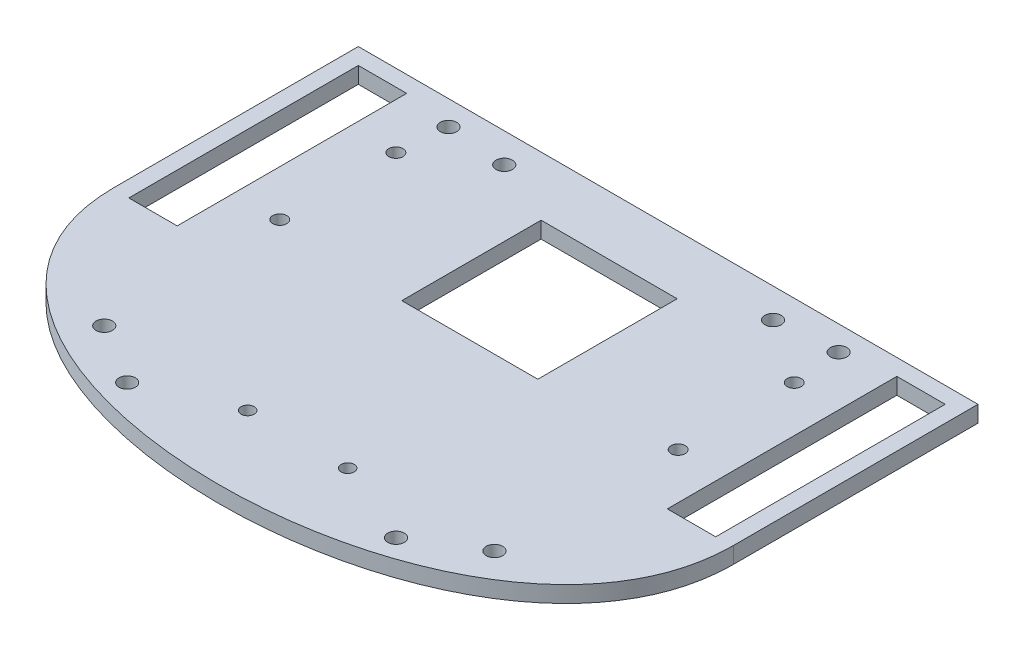
ISO-10303-21;
HEADER;
FILE_DESCRIPTION(('STEP AP214'),'2;1');
FILE_NAME('part.step','',(''),(''),'','','');
FILE_SCHEMA(('AUTOMOTIVE_DESIGN { 1 0 10303 214 1 1 1 1 }'));
ENDSEC;
DATA;
#1=APPLICATION_CONTEXT('core data for automotive mechanical design processes');
#2=APPLICATION_PROTOCOL_DEFINITION('international standard','automotive_design',2000,#1);
#3=PRODUCT_CONTEXT('',#1,'mechanical');
#4=PRODUCT('Part','Part','',(#3));
#5=PRODUCT_RELATED_PRODUCT_CATEGORY('part','',(#4));
#6=PRODUCT_DEFINITION_FORMATION('','',#4);
#7=PRODUCT_DEFINITION_CONTEXT('part definition',#1,'design');
#8=PRODUCT_DEFINITION('design','',#6,#7);
#9=PRODUCT_DEFINITION_SHAPE('','',#8);
#10=(LENGTH_UNIT() NAMED_UNIT(*) SI_UNIT(.MILLI.,.METRE.));
#11=(NAMED_UNIT(*) PLANE_ANGLE_UNIT() SI_UNIT($,.RADIAN.));
#12=(NAMED_UNIT(*) SI_UNIT($,.STERADIAN.) SOLID_ANGLE_UNIT());
#13=UNCERTAINTY_MEASURE_WITH_UNIT(LENGTH_MEASURE(1.E-05),#10,'distance_accuracy_value','');
#14=(GEOMETRIC_REPRESENTATION_CONTEXT(3) GLOBAL_UNCERTAINTY_ASSIGNED_CONTEXT((#13)) GLOBAL_UNIT_ASSIGNED_CONTEXT((#10,
#11,#12)) REPRESENTATION_CONTEXT('',''));
#15=CARTESIAN_POINT('',(0.,0.,0.));
#16=DIRECTION('',(0.,0.,1.));
#17=DIRECTION('',(1.,0.,0.));
#18=AXIS2_PLACEMENT_3D('',#15,#16,#17);
#19=CARTESIAN_POINT('',(-48.006,2.54,-34.798));
#20=DIRECTION('',(1.,0.,0.));
#21=DIRECTION('',(0.,0.,-1.));
#22=AXIS2_PLACEMENT_3D('',#19,#20,#21);
#23=PLANE('',#22);
#24=DIRECTION('',(0.,0.,1.));
#25=VECTOR('',#24,1.);
#26=CARTESIAN_POINT('',(-48.006,0.,-34.798));
#27=LINE('',#26,#25);
#28=CARTESIAN_POINT('',(-48.006,0.,-34.798));
#29=VERTEX_POINT('',#28);
#30=CARTESIAN_POINT('',(-48.006,0.,3.04800000000002));
#31=VERTEX_POINT('',#30);
#32=EDGE_CURVE('E338',#29,#31,#27,.T.);
#33=ORIENTED_EDGE('',*,*,#32,.T.);
#34=DIRECTION('',(0.,-1.,0.));
#35=VECTOR('',#34,1.);
#36=CARTESIAN_POINT('',(-48.006,2.54,3.04800000000002));
#37=LINE('',#36,#35);
#38=CARTESIAN_POINT('',(-48.006,2.54,3.04800000000002));
#39=VERTEX_POINT('',#38);
#40=EDGE_CURVE('E11',#39,#31,#37,.T.);
#41=ORIENTED_EDGE('',*,*,#40,.F.);
#42=DIRECTION('',(0.,0.,1.));
#43=VECTOR('',#42,1.);
#44=CARTESIAN_POINT('',(-48.006,2.54,-34.798));
#45=LINE('',#44,#43);
#46=CARTESIAN_POINT('',(-48.006,2.54,-34.798));
#47=VERTEX_POINT('',#46);
#48=EDGE_CURVE('E339',#47,#39,#45,.T.);
#49=ORIENTED_EDGE('',*,*,#48,.F.);
#50=DIRECTION('',(0.,-1.,0.));
#51=VECTOR('',#50,1.);
#52=CARTESIAN_POINT('',(-48.006,2.54,-34.798));
#53=LINE('',#52,#51);
#54=EDGE_CURVE('E481',#47,#29,#53,.T.);
#55=ORIENTED_EDGE('',*,*,#54,.T.);
#56=EDGE_LOOP('',(#33,#41,#49,#55));
#57=FACE_BOUND('',#56,.T.);
#58=ADVANCED_FACE('F32',(#57),#23,.F.);
#59=CARTESIAN_POINT('',(-48.006,2.54,3.04800000000002));
#60=CARTESIAN_POINT('',(-48.006,2.54,45.3813333333333));
#61=CARTESIAN_POINT('',(48.0060000000003,2.54,45.3813333333333));
#62=CARTESIAN_POINT('',(48.006,2.54,3.04800000000002));
#63=B_SPLINE_CURVE_WITH_KNOTS('',3,(#59,#60,#61,#62),.UNSPECIFIED.,.F.,.F.,(4,4),(0.,1.),.UNSPECIFIED.);
#64=DIRECTION('',(0.,-1.,0.));
#65=VECTOR('',#64,1.);
#66=SURFACE_OF_LINEAR_EXTRUSION('',#63,#65);
#67=CARTESIAN_POINT('',(-48.006,0.,3.04800000000002));
#68=CARTESIAN_POINT('',(-48.006,0.,45.3813333333333));
#69=CARTESIAN_POINT('',(48.0060000000003,0.,45.3813333333333));
#70=CARTESIAN_POINT('',(48.006,0.,3.04800000000002));
#71=B_SPLINE_CURVE_WITH_KNOTS('',3,(#67,#68,#69,#70),.UNSPECIFIED.,.F.,.F.,(4,4),(0.,1.),.UNSPECIFIED.);
#72=CARTESIAN_POINT('',(48.006,0.,3.04800000000002));
#73=VERTEX_POINT('',#72);
#74=EDGE_CURVE('E484',#31,#73,#71,.T.);
#75=ORIENTED_EDGE('',*,*,#74,.T.);
#76=DIRECTION('',(0.,-1.,0.));
#77=VECTOR('',#76,1.);
#78=CARTESIAN_POINT('',(48.006,2.54,3.04800000000002));
#79=LINE('',#78,#77);
#80=CARTESIAN_POINT('',(48.006,2.54,3.04800000000002));
#81=VERTEX_POINT('',#80);
#82=EDGE_CURVE('E39',#81,#73,#79,.T.);
#83=ORIENTED_EDGE('',*,*,#82,.F.);
#84=EDGE_CURVE('E342',#39,#81,#63,.T.);
#85=ORIENTED_EDGE('',*,*,#84,.F.);
#86=ORIENTED_EDGE('',*,*,#40,.T.);
#87=EDGE_LOOP('',(#75,#83,#85,#86));
#88=FACE_BOUND('',#87,.T.);
#89=ADVANCED_FACE('F353',(#88),#66,.F.);
#90=CARTESIAN_POINT('',(48.006,2.54,-34.798));
#91=DIRECTION('',(-1.,0.,0.));
#92=DIRECTION('',(0.,0.,1.));
#93=AXIS2_PLACEMENT_3D('',#90,#91,#92);
#94=PLANE('',#93);
#95=DIRECTION('',(0.,0.,-1.));
#96=VECTOR('',#95,1.);
#97=CARTESIAN_POINT('',(48.006,0.,-34.798));
#98=LINE('',#97,#96);
#99=CARTESIAN_POINT('',(48.006,0.,-34.798));
#100=VERTEX_POINT('',#99);
#101=EDGE_CURVE('E486',#73,#100,#98,.T.);
#102=ORIENTED_EDGE('',*,*,#101,.T.);
#103=DIRECTION('',(0.,-1.,0.));
#104=VECTOR('',#103,1.);
#105=CARTESIAN_POINT('',(48.006,2.54,-34.798));
#106=LINE('',#105,#104);
#107=CARTESIAN_POINT('',(48.006,2.54,-34.798));
#108=VERTEX_POINT('',#107);
#109=EDGE_CURVE('E498',#108,#100,#106,.T.);
#110=ORIENTED_EDGE('',*,*,#109,.F.);
#111=DIRECTION('',(0.,0.,-1.));
#112=VECTOR('',#111,1.);
#113=CARTESIAN_POINT('',(48.006,2.54,-34.798));
#114=LINE('',#113,#112);
#115=EDGE_CURVE('E348',#81,#108,#114,.T.);
#116=ORIENTED_EDGE('',*,*,#115,.F.);
#117=ORIENTED_EDGE('',*,*,#82,.T.);
#118=EDGE_LOOP('',(#102,#110,#116,#117));
#119=FACE_BOUND('',#118,.T.);
#120=ADVANCED_FACE('F356',(#119),#94,.F.);
#121=CARTESIAN_POINT('',(48.006,2.54,-34.798));
#122=DIRECTION('',(0.,0.,1.));
#123=DIRECTION('',(1.,0.,0.));
#124=AXIS2_PLACEMENT_3D('',#121,#122,#123);
#125=PLANE('',#124);
#126=DIRECTION('',(-1.,0.,0.));
#127=VECTOR('',#126,1.);
#128=CARTESIAN_POINT('',(48.006,0.,-34.798));
#129=LINE('',#128,#127);
#130=EDGE_CURVE('E343',#100,#29,#129,.T.);
#131=ORIENTED_EDGE('',*,*,#130,.T.);
#132=ORIENTED_EDGE('',*,*,#54,.F.);
#133=DIRECTION('',(-1.,0.,0.));
#134=VECTOR('',#133,1.);
#135=CARTESIAN_POINT('',(48.006,2.54,-34.798));
#136=LINE('',#135,#134);
#137=EDGE_CURVE('E488',#108,#47,#136,.T.);
#138=ORIENTED_EDGE('',*,*,#137,.F.);
#139=ORIENTED_EDGE('',*,*,#109,.T.);
#140=EDGE_LOOP('',(#131,#132,#138,#139));
#141=FACE_BOUND('',#140,.T.);
#142=ADVANCED_FACE('F360',(#141),#125,.F.);
#143=CARTESIAN_POINT('',(1.04083408558608E-13,2.54,34.798));
#144=DIRECTION('',(0.,-1.,0.));
#145=DIRECTION('',(0.,0.,-1.));
#146=AXIS2_PLACEMENT_3D('',#143,#144,#145);
#147=PLANE('',#146);
#148=DIRECTION('',(-1.,0.,0.));
#149=VECTOR('',#148,1.);
#150=CARTESIAN_POINT('',(0.,2.54,3.30199999999998));
#151=LINE('',#150,#149);
#152=CARTESIAN_POINT('',(-37.973,2.54,3.30199999999998));
#153=VERTEX_POINT('',#152);
#154=CARTESIAN_POINT('',(-45.466,2.54,3.30199999999999));
#155=VERTEX_POINT('',#154);
#156=EDGE_CURVE('E329',#153,#155,#151,.T.);
#157=ORIENTED_EDGE('',*,*,#156,.T.);
#158=DIRECTION('',(0.,0.,-1.));
#159=VECTOR('',#158,1.);
#160=CARTESIAN_POINT('',(-45.466,2.54,34.798));
#161=LINE('',#160,#159);
#162=CARTESIAN_POINT('',(-45.466,2.54,-32.258));
#163=VERTEX_POINT('',#162);
#164=EDGE_CURVE('E149',#155,#163,#161,.T.);
#165=ORIENTED_EDGE('',*,*,#164,.T.);
#166=DIRECTION('',(1.,0.,0.));
#167=VECTOR('',#166,1.);
#168=CARTESIAN_POINT('',(1.66180628580015E-13,2.54,-32.258));
#169=LINE('',#168,#167);
#170=CARTESIAN_POINT('',(-37.973,2.54,-32.258));
#171=VERTEX_POINT('',#170);
#172=EDGE_CURVE('E334',#163,#171,#169,.T.);
#173=ORIENTED_EDGE('',*,*,#172,.T.);
#174=DIRECTION('',(0.,0.,1.));
#175=VECTOR('',#174,1.);
#176=CARTESIAN_POINT('',(-37.973,2.54,34.798));
#177=LINE('',#176,#175);
#178=EDGE_CURVE('E331',#171,#153,#177,.T.);
#179=ORIENTED_EDGE('',*,*,#178,.T.);
#180=EDGE_LOOP('',(#157,#165,#173,#179));
#181=FACE_BOUND('',#180,.T.);
#182=CARTESIAN_POINT('',(7.747,2.54,22.606));
#183=DIRECTION('',(0.,-1.,0.));
#184=DIRECTION('',(0.,0.,-1.));
#185=AXIS2_PLACEMENT_3D('',#182,#183,#184);
#186=CIRCLE('',#185,1.016);
#187=CARTESIAN_POINT('',(7.747,2.54,21.59));
#188=VERTEX_POINT('',#187);
#189=EDGE_CURVE('E326',#188,#188,#186,.T.);
#190=ORIENTED_EDGE('',*,*,#189,.T.);
#191=EDGE_LOOP('',(#190));
#192=FACE_BOUND('',#191,.T.);
#193=DIRECTION('',(-1.,0.,0.));
#194=VECTOR('',#193,1.);
#195=CARTESIAN_POINT('',(1.04083408558608E-13,2.54,-4.06400000000001));
#196=LINE('',#195,#194);
#197=CARTESIAN_POINT('',(10.541,2.54,-4.06400000000001));
#198=VERTEX_POINT('',#197);
#199=CARTESIAN_POINT('',(-10.541,2.54,-4.06400000000001));
#200=VERTEX_POINT('',#199);
#201=EDGE_CURVE('E314',#198,#200,#196,.T.);
#202=ORIENTED_EDGE('',*,*,#201,.T.);
#203=DIRECTION('',(0.,0.,-1.));
#204=VECTOR('',#203,1.);
#205=CARTESIAN_POINT('',(-10.541,2.54,34.798));
#206=LINE('',#205,#204);
#207=CARTESIAN_POINT('',(-10.541,2.54,-25.654));
#208=VERTEX_POINT('',#207);
#209=EDGE_CURVE('E323',#200,#208,#206,.T.);
#210=ORIENTED_EDGE('',*,*,#209,.T.);
#211=DIRECTION('',(1.,0.,0.));
#212=VECTOR('',#211,1.);
#213=CARTESIAN_POINT('',(1.04083408558608E-13,2.54,-25.654));
#214=LINE('',#213,#212);
#215=CARTESIAN_POINT('',(10.541,2.54,-25.654));
#216=VERTEX_POINT('',#215);
#217=EDGE_CURVE('E320',#208,#216,#214,.T.);
#218=ORIENTED_EDGE('',*,*,#217,.T.);
#219=DIRECTION('',(0.,0.,1.));
#220=VECTOR('',#219,1.);
#221=CARTESIAN_POINT('',(10.541,2.54,34.798));
#222=LINE('',#221,#220);
#223=EDGE_CURVE('E317',#216,#198,#222,.T.);
#224=ORIENTED_EDGE('',*,*,#223,.T.);
#225=EDGE_LOOP('',(#202,#210,#218,#224));
#226=FACE_BOUND('',#225,.T.);
#227=CARTESIAN_POINT('',(-7.747,2.54,22.606));
#228=DIRECTION('',(0.,-1.,0.));
#229=DIRECTION('',(0.,0.,-1.));
#230=AXIS2_PLACEMENT_3D('',#227,#228,#229);
#231=CIRCLE('',#230,1.016);
#232=CARTESIAN_POINT('',(-7.747,2.54,21.59));
#233=VERTEX_POINT('',#232);
#234=EDGE_CURVE('E311',#233,#233,#231,.T.);
#235=ORIENTED_EDGE('',*,*,#234,.T.);
#236=EDGE_LOOP('',(#235));
#237=FACE_BOUND('',#236,.T.);
#238=CARTESIAN_POINT('',(30.226,2.54,-30.988));
#239=DIRECTION('',(0.,-1.,0.));
#240=DIRECTION('',(0.,0.,-1.));
#241=AXIS2_PLACEMENT_3D('',#238,#239,#240);
#242=CIRCLE('',#241,1.27);
#243=CARTESIAN_POINT('',(30.226,2.54,-32.258));
#244=VERTEX_POINT('',#243);
#245=EDGE_CURVE('E308',#244,#244,#242,.T.);
#246=ORIENTED_EDGE('',*,*,#245,.T.);
#247=EDGE_LOOP('',(#246));
#248=FACE_BOUND('',#247,.T.);
#249=CARTESIAN_POINT('',(-20.828,2.54,-30.226));
#250=DIRECTION('',(0.,-1.,0.));
#251=DIRECTION('',(0.,0.,-1.));
#252=AXIS2_PLACEMENT_3D('',#249,#250,#251);
#253=CIRCLE('',#252,1.27);
#254=CARTESIAN_POINT('',(-20.828,2.54,-31.496));
#255=VERTEX_POINT('',#254);
#256=EDGE_CURVE('E305',#255,#255,#253,.T.);
#257=ORIENTED_EDGE('',*,*,#256,.T.);
#258=EDGE_LOOP('',(#257));
#259=FACE_BOUND('',#258,.T.);
#260=CARTESIAN_POINT('',(-20.828,2.54,28.194));
#261=DIRECTION('',(0.,-1.,0.));
#262=DIRECTION('',(0.,0.,-1.));
#263=AXIS2_PLACEMENT_3D('',#260,#261,#262);
#264=CIRCLE('',#263,1.27);
#265=CARTESIAN_POINT('',(-20.828,2.54,26.924));
#266=VERTEX_POINT('',#265);
#267=EDGE_CURVE('E302',#266,#266,#264,.T.);
#268=ORIENTED_EDGE('',*,*,#267,.T.);
#269=EDGE_LOOP('',(#268));
#270=FACE_BOUND('',#269,.T.);
#271=CARTESIAN_POINT('',(20.828,2.54,28.194));
#272=DIRECTION('',(0.,-1.,0.));
#273=DIRECTION('',(0.,0.,-1.));
#274=AXIS2_PLACEMENT_3D('',#271,#272,#273);
#275=CIRCLE('',#274,1.27);
#276=CARTESIAN_POINT('',(20.828,2.54,26.924));
#277=VERTEX_POINT('',#276);
#278=EDGE_CURVE('E299',#277,#277,#275,.T.);
#279=ORIENTED_EDGE('',*,*,#278,.T.);
#280=EDGE_LOOP('',(#279));
#281=FACE_BOUND('',#280,.T.);
#282=CARTESIAN_POINT('',(20.828,2.54,-30.226));
#283=DIRECTION('',(0.,-1.,0.));
#284=DIRECTION('',(0.,0.,-1.));
#285=AXIS2_PLACEMENT_3D('',#282,#283,#284);
#286=CIRCLE('',#285,1.27);
#287=CARTESIAN_POINT('',(20.828,2.54,-31.496));
#288=VERTEX_POINT('',#287);
#289=EDGE_CURVE('E296',#288,#288,#286,.T.);
#290=ORIENTED_EDGE('',*,*,#289,.T.);
#291=EDGE_LOOP('',(#290));
#292=FACE_BOUND('',#291,.T.);
#293=CARTESIAN_POINT('',(-30.861,2.54,-5.48640000000001));
#294=DIRECTION('',(0.,-1.,0.));
#295=DIRECTION('',(0.,0.,-1.));
#296=AXIS2_PLACEMENT_3D('',#293,#294,#295);
#297=CIRCLE('',#296,1.0922);
#298=CARTESIAN_POINT('',(-30.861,2.54,-6.57860000000001));
#299=VERTEX_POINT('',#298);
#300=EDGE_CURVE('E293',#299,#299,#297,.T.);
#301=ORIENTED_EDGE('',*,*,#300,.T.);
#302=EDGE_LOOP('',(#301));
#303=FACE_BOUND('',#302,.T.);
#304=CARTESIAN_POINT('',(-30.226,2.54,-30.988));
#305=DIRECTION('',(0.,-1.,0.));
#306=DIRECTION('',(0.,0.,-1.));
#307=AXIS2_PLACEMENT_3D('',#304,#305,#306);
#308=CIRCLE('',#307,1.27);
#309=CARTESIAN_POINT('',(-30.226,2.54,-32.258));
#310=VERTEX_POINT('',#309);
#311=EDGE_CURVE('E290',#310,#310,#308,.T.);
#312=ORIENTED_EDGE('',*,*,#311,.T.);
#313=EDGE_LOOP('',(#312));
#314=FACE_BOUND('',#313,.T.);
#315=CARTESIAN_POINT('',(-30.861,2.54,-23.4696));
#316=DIRECTION('',(0.,-1.,0.));
#317=DIRECTION('',(0.,0.,-1.));
#318=AXIS2_PLACEMENT_3D('',#315,#316,#317);
#319=CIRCLE('',#318,1.0922);
#320=CARTESIAN_POINT('',(-30.861,2.54,-24.5618));
#321=VERTEX_POINT('',#320);
#322=EDGE_CURVE('E287',#321,#321,#319,.T.);
#323=ORIENTED_EDGE('',*,*,#322,.T.);
#324=EDGE_LOOP('',(#323));
#325=FACE_BOUND('',#324,.T.);
#326=DIRECTION('',(0.,0.,-1.));
#327=VECTOR('',#326,1.);
#328=CARTESIAN_POINT('',(37.973,2.54,34.798));
#329=LINE('',#328,#327);
#330=CARTESIAN_POINT('',(37.973,2.54,3.30199999999998));
#331=VERTEX_POINT('',#330);
#332=CARTESIAN_POINT('',(37.973,2.54,-32.258));
#333=VERTEX_POINT('',#332);
#334=EDGE_CURVE('E275',#331,#333,#329,.T.);
#335=ORIENTED_EDGE('',*,*,#334,.T.);
#336=DIRECTION('',(1.,0.,0.));
#337=VECTOR('',#336,1.);
#338=CARTESIAN_POINT('',(0.,2.54,-32.258));
#339=LINE('',#338,#337);
#340=CARTESIAN_POINT('',(45.466,2.54,-32.258));
#341=VERTEX_POINT('',#340);
#342=EDGE_CURVE('E284',#333,#341,#339,.T.);
#343=ORIENTED_EDGE('',*,*,#342,.T.);
#344=DIRECTION('',(0.,0.,1.));
#345=VECTOR('',#344,1.);
#346=CARTESIAN_POINT('',(45.466,2.54,34.798));
#347=LINE('',#346,#345);
#348=CARTESIAN_POINT('',(45.466,2.54,3.30199999999999));
#349=VERTEX_POINT('',#348);
#350=EDGE_CURVE('E281',#341,#349,#347,.T.);
#351=ORIENTED_EDGE('',*,*,#350,.T.);
#352=DIRECTION('',(-1.,0.,0.));
#353=VECTOR('',#352,1.);
#354=CARTESIAN_POINT('',(1.38719073892518E-13,2.54,3.30199999999994));
#355=LINE('',#354,#353);
#356=EDGE_CURVE('E278',#349,#331,#355,.T.);
#357=ORIENTED_EDGE('',*,*,#356,.T.);
#358=EDGE_LOOP('',(#335,#343,#351,#357));
#359=FACE_BOUND('',#358,.T.);
#360=CARTESIAN_POINT('',(30.861,2.54,-5.48640000000001));
#361=DIRECTION('',(0.,-1.,0.));
#362=DIRECTION('',(0.,0.,-1.));
#363=AXIS2_PLACEMENT_3D('',#360,#361,#362);
#364=CIRCLE('',#363,1.09219999999999);
#365=CARTESIAN_POINT('',(30.861,2.54,-6.5786));
#366=VERTEX_POINT('',#365);
#367=EDGE_CURVE('E272',#366,#366,#364,.T.);
#368=ORIENTED_EDGE('',*,*,#367,.T.);
#369=EDGE_LOOP('',(#368));
#370=FACE_BOUND('',#369,.T.);
#371=CARTESIAN_POINT('',(30.861,2.54,-23.4696));
#372=DIRECTION('',(0.,-1.,0.));
#373=DIRECTION('',(0.,0.,-1.));
#374=AXIS2_PLACEMENT_3D('',#371,#372,#373);
#375=CIRCLE('',#374,1.09219999999999);
#376=CARTESIAN_POINT('',(30.861,2.54,-24.5618));
#377=VERTEX_POINT('',#376);
#378=EDGE_CURVE('E269',#377,#377,#375,.T.);
#379=ORIENTED_EDGE('',*,*,#378,.T.);
#380=EDGE_LOOP('',(#379));
#381=FACE_BOUND('',#380,.T.);
#382=CARTESIAN_POINT('',(-30.226,2.54,22.352));
#383=DIRECTION('',(0.,-1.,0.));
#384=DIRECTION('',(0.,0.,-1.));
#385=AXIS2_PLACEMENT_3D('',#382,#383,#384);
#386=CIRCLE('',#385,1.27);
#387=CARTESIAN_POINT('',(-30.226,2.54,21.082));
#388=VERTEX_POINT('',#387);
#389=EDGE_CURVE('E266',#388,#388,#386,.T.);
#390=ORIENTED_EDGE('',*,*,#389,.T.);
#391=EDGE_LOOP('',(#390));
#392=FACE_BOUND('',#391,.T.);
#393=CARTESIAN_POINT('',(30.226,2.54,22.352));
#394=DIRECTION('',(0.,-1.,0.));
#395=DIRECTION('',(0.,0.,-1.));
#396=AXIS2_PLACEMENT_3D('',#393,#394,#395);
#397=CIRCLE('',#396,1.27);
#398=CARTESIAN_POINT('',(30.226,2.54,21.082));
#399=VERTEX_POINT('',#398);
#400=EDGE_CURVE('E176',#399,#399,#397,.T.);
#401=ORIENTED_EDGE('',*,*,#400,.T.);
#402=EDGE_LOOP('',(#401));
#403=FACE_BOUND('',#402,.T.);
#404=ORIENTED_EDGE('',*,*,#48,.T.);
#405=ORIENTED_EDGE('',*,*,#84,.T.);
#406=ORIENTED_EDGE('',*,*,#115,.T.);
#407=ORIENTED_EDGE('',*,*,#137,.T.);
#408=EDGE_LOOP('',(#404,#405,#406,#407));
#409=FACE_BOUND('',#408,.T.);
#410=ADVANCED_FACE('F364',(#181,#192,#226,#237,#248,#259,#270,#281,#292,#303,#314,#325,#359,
#370,#381,#392,#403,#409),#147,.F.);
#411=CARTESIAN_POINT('',(1.04083408558608E-13,0.,34.798));
#412=DIRECTION('',(0.,-1.,0.));
#413=DIRECTION('',(0.,0.,-1.));
#414=AXIS2_PLACEMENT_3D('',#411,#412,#413);
#415=PLANE('',#414);
#416=DIRECTION('',(0.,0.,1.));
#417=VECTOR('',#416,1.);
#418=CARTESIAN_POINT('',(-45.466,0.,-32.258));
#419=LINE('',#418,#417);
#420=CARTESIAN_POINT('',(-45.466,0.,-32.258));
#421=VERTEX_POINT('',#420);
#422=CARTESIAN_POINT('',(-45.466,0.,3.30199999999999));
#423=VERTEX_POINT('',#422);
#424=EDGE_CURVE('E146',#421,#423,#419,.T.);
#425=ORIENTED_EDGE('',*,*,#424,.T.);
#426=DIRECTION('',(1.,0.,0.));
#427=VECTOR('',#426,1.);
#428=CARTESIAN_POINT('',(-45.466,0.,3.30199999999999));
#429=LINE('',#428,#427);
#430=CARTESIAN_POINT('',(-37.973,0.,3.30199999999998));
#431=VERTEX_POINT('',#430);
#432=EDGE_CURVE('E156',#423,#431,#429,.T.);
#433=ORIENTED_EDGE('',*,*,#432,.T.);
#434=DIRECTION('',(0.,0.,-1.));
#435=VECTOR('',#434,1.);
#436=CARTESIAN_POINT('',(-37.973,0.,-32.258));
#437=LINE('',#436,#435);
#438=CARTESIAN_POINT('',(-37.973,0.,-32.258));
#439=VERTEX_POINT('',#438);
#440=EDGE_CURVE('E161',#431,#439,#437,.T.);
#441=ORIENTED_EDGE('',*,*,#440,.T.);
#442=DIRECTION('',(-1.,0.,0.));
#443=VECTOR('',#442,1.);
#444=CARTESIAN_POINT('',(-45.466,0.,-32.258));
#445=LINE('',#444,#443);
#446=EDGE_CURVE('E152',#439,#421,#445,.T.);
#447=ORIENTED_EDGE('',*,*,#446,.T.);
#448=EDGE_LOOP('',(#425,#433,#441,#447));
#449=FACE_BOUND('',#448,.T.);
#450=CARTESIAN_POINT('',(7.747,0.,22.606));
#451=DIRECTION('',(0.,1.,0.));
#452=DIRECTION('',(0.,0.,-1.));
#453=AXIS2_PLACEMENT_3D('',#450,#451,#452);
#454=CIRCLE('',#453,1.016);
#455=CARTESIAN_POINT('',(7.747,0.,21.59));
#456=VERTEX_POINT('',#455);
#457=EDGE_CURVE('E184',#456,#456,#454,.T.);
#458=ORIENTED_EDGE('',*,*,#457,.T.);
#459=EDGE_LOOP('',(#458));
#460=FACE_BOUND('',#459,.T.);
#461=DIRECTION('',(0.,0.,1.));
#462=VECTOR('',#461,1.);
#463=CARTESIAN_POINT('',(-10.541,0.,-25.654));
#464=LINE('',#463,#462);
#465=CARTESIAN_POINT('',(-10.541,0.,-25.654));
#466=VERTEX_POINT('',#465);
#467=CARTESIAN_POINT('',(-10.541,0.,-4.06400000000001));
#468=VERTEX_POINT('',#467);
#469=EDGE_CURVE('E194',#466,#468,#464,.T.);
#470=ORIENTED_EDGE('',*,*,#469,.T.);
#471=DIRECTION('',(1.,0.,0.));
#472=VECTOR('',#471,1.);
#473=CARTESIAN_POINT('',(-10.541,0.,-4.06400000000001));
#474=LINE('',#473,#472);
#475=CARTESIAN_POINT('',(10.541,0.,-4.06400000000001));
#476=VERTEX_POINT('',#475);
#477=EDGE_CURVE('E197',#468,#476,#474,.T.);
#478=ORIENTED_EDGE('',*,*,#477,.T.);
#479=DIRECTION('',(0.,0.,-1.));
#480=VECTOR('',#479,1.);
#481=CARTESIAN_POINT('',(10.541,0.,-25.654));
#482=LINE('',#481,#480);
#483=CARTESIAN_POINT('',(10.541,0.,-25.654));
#484=VERTEX_POINT('',#483);
#485=EDGE_CURVE('E200',#476,#484,#482,.T.);
#486=ORIENTED_EDGE('',*,*,#485,.T.);
#487=DIRECTION('',(-1.,0.,0.));
#488=VECTOR('',#487,1.);
#489=CARTESIAN_POINT('',(-10.541,0.,-25.654));
#490=LINE('',#489,#488);
#491=EDGE_CURVE('E203',#484,#466,#490,.T.);
#492=ORIENTED_EDGE('',*,*,#491,.T.);
#493=EDGE_LOOP('',(#470,#478,#486,#492));
#494=FACE_BOUND('',#493,.T.);
#495=CARTESIAN_POINT('',(-7.747,0.,22.606));
#496=DIRECTION('',(0.,1.,0.));
#497=DIRECTION('',(0.,0.,1.));
#498=AXIS2_PLACEMENT_3D('',#495,#496,#497);
#499=CIRCLE('',#498,1.016);
#500=CARTESIAN_POINT('',(-7.747,0.,23.622));
#501=VERTEX_POINT('',#500);
#502=EDGE_CURVE('E209',#501,#501,#499,.T.);
#503=ORIENTED_EDGE('',*,*,#502,.T.);
#504=EDGE_LOOP('',(#503));
#505=FACE_BOUND('',#504,.T.);
#506=CARTESIAN_POINT('',(30.226,0.,-30.988));
#507=DIRECTION('',(0.,1.,0.));
#508=DIRECTION('',(0.,0.,-1.));
#509=AXIS2_PLACEMENT_3D('',#506,#507,#508);
#510=CIRCLE('',#509,1.27);
#511=CARTESIAN_POINT('',(30.226,0.,-32.258));
#512=VERTEX_POINT('',#511);
#513=EDGE_CURVE('E219',#512,#512,#510,.T.);
#514=ORIENTED_EDGE('',*,*,#513,.T.);
#515=EDGE_LOOP('',(#514));
#516=FACE_BOUND('',#515,.T.);
#517=CARTESIAN_POINT('',(-20.828,0.,-30.226));
#518=DIRECTION('',(0.,1.,0.));
#519=DIRECTION('',(0.,0.,1.));
#520=AXIS2_PLACEMENT_3D('',#517,#518,#519);
#521=CIRCLE('',#520,1.27);
#522=CARTESIAN_POINT('',(-20.828,0.,-28.956));
#523=VERTEX_POINT('',#522);
#524=EDGE_CURVE('E181',#523,#523,#521,.T.);
#525=ORIENTED_EDGE('',*,*,#524,.T.);
#526=EDGE_LOOP('',(#525));
#527=FACE_BOUND('',#526,.T.);
#528=CARTESIAN_POINT('',(-20.828,0.,28.194));
#529=DIRECTION('',(0.,1.,0.));
#530=DIRECTION('',(0.,0.,1.));
#531=AXIS2_PLACEMENT_3D('',#528,#529,#530);
#532=CIRCLE('',#531,1.27);
#533=CARTESIAN_POINT('',(-20.828,0.,29.464));
#534=VERTEX_POINT('',#533);
#535=EDGE_CURVE('E185',#534,#534,#532,.T.);
#536=ORIENTED_EDGE('',*,*,#535,.T.);
#537=EDGE_LOOP('',(#536));
#538=FACE_BOUND('',#537,.T.);
#539=CARTESIAN_POINT('',(20.828,0.,28.194));
#540=DIRECTION('',(0.,1.,0.));
#541=DIRECTION('',(0.,0.,-1.));
#542=AXIS2_PLACEMENT_3D('',#539,#540,#541);
#543=CIRCLE('',#542,1.27);
#544=CARTESIAN_POINT('',(20.828,0.,26.924));
#545=VERTEX_POINT('',#544);
#546=EDGE_CURVE('E188',#545,#545,#543,.T.);
#547=ORIENTED_EDGE('',*,*,#546,.T.);
#548=EDGE_LOOP('',(#547));
#549=FACE_BOUND('',#548,.T.);
#550=CARTESIAN_POINT('',(20.828,0.,-30.226));
#551=DIRECTION('',(0.,1.,0.));
#552=DIRECTION('',(0.,0.,-1.));
#553=AXIS2_PLACEMENT_3D('',#550,#551,#552);
#554=CIRCLE('',#553,1.27);
#555=CARTESIAN_POINT('',(20.828,0.,-31.496));
#556=VERTEX_POINT('',#555);
#557=EDGE_CURVE('E191',#556,#556,#554,.T.);
#558=ORIENTED_EDGE('',*,*,#557,.T.);
#559=EDGE_LOOP('',(#558));
#560=FACE_BOUND('',#559,.T.);
#561=CARTESIAN_POINT('',(-30.861,0.,-5.48640000000001));
#562=DIRECTION('',(0.,1.,0.));
#563=DIRECTION('',(0.,0.,1.));
#564=AXIS2_PLACEMENT_3D('',#561,#562,#563);
#565=CIRCLE('',#564,1.0922);
#566=CARTESIAN_POINT('',(-30.861,0.,-4.39420000000001));
#567=VERTEX_POINT('',#566);
#568=EDGE_CURVE('E228',#567,#567,#565,.T.);
#569=ORIENTED_EDGE('',*,*,#568,.T.);
#570=EDGE_LOOP('',(#569));
#571=FACE_BOUND('',#570,.T.);
#572=CARTESIAN_POINT('',(-30.226,0.,-30.988));
#573=DIRECTION('',(0.,1.,0.));
#574=DIRECTION('',(0.,0.,1.));
#575=AXIS2_PLACEMENT_3D('',#572,#573,#574);
#576=CIRCLE('',#575,1.27);
#577=CARTESIAN_POINT('',(-30.226,0.,-29.718));
#578=VERTEX_POINT('',#577);
#579=EDGE_CURVE('E237',#578,#578,#576,.T.);
#580=ORIENTED_EDGE('',*,*,#579,.T.);
#581=EDGE_LOOP('',(#580));
#582=FACE_BOUND('',#581,.T.);
#583=CARTESIAN_POINT('',(-30.861,0.,-23.4696));
#584=DIRECTION('',(0.,1.,0.));
#585=DIRECTION('',(0.,0.,1.));
#586=AXIS2_PLACEMENT_3D('',#583,#584,#585);
#587=CIRCLE('',#586,1.0922);
#588=CARTESIAN_POINT('',(-30.861,0.,-22.3774));
#589=VERTEX_POINT('',#588);
#590=EDGE_CURVE('E240',#589,#589,#587,.T.);
#591=ORIENTED_EDGE('',*,*,#590,.T.);
#592=EDGE_LOOP('',(#591));
#593=FACE_BOUND('',#592,.T.);
#594=DIRECTION('',(-1.,0.,0.));
#595=VECTOR('',#594,1.);
#596=CARTESIAN_POINT('',(45.466,0.,-32.258));
#597=LINE('',#596,#595);
#598=CARTESIAN_POINT('',(45.466,0.,-32.258));
#599=VERTEX_POINT('',#598);
#600=CARTESIAN_POINT('',(37.973,0.,-32.258));
#601=VERTEX_POINT('',#600);
#602=EDGE_CURVE('E243',#599,#601,#597,.T.);
#603=ORIENTED_EDGE('',*,*,#602,.T.);
#604=DIRECTION('',(0.,0.,1.));
#605=VECTOR('',#604,1.);
#606=CARTESIAN_POINT('',(37.973,0.,-32.258));
#607=LINE('',#606,#605);
#608=CARTESIAN_POINT('',(37.973,0.,3.30199999999999));
#609=VERTEX_POINT('',#608);
#610=EDGE_CURVE('E246',#601,#609,#607,.T.);
#611=ORIENTED_EDGE('',*,*,#610,.T.);
#612=DIRECTION('',(1.,0.,0.));
#613=VECTOR('',#612,1.);
#614=CARTESIAN_POINT('',(45.466,0.,3.30199999999999));
#615=LINE('',#614,#613);
#616=CARTESIAN_POINT('',(45.466,0.,3.30199999999999));
#617=VERTEX_POINT('',#616);
#618=EDGE_CURVE('E249',#609,#617,#615,.T.);
#619=ORIENTED_EDGE('',*,*,#618,.T.);
#620=DIRECTION('',(0.,0.,-1.));
#621=VECTOR('',#620,1.);
#622=CARTESIAN_POINT('',(45.466,0.,-32.258));
#623=LINE('',#622,#621);
#624=EDGE_CURVE('E252',#617,#599,#623,.T.);
#625=ORIENTED_EDGE('',*,*,#624,.T.);
#626=EDGE_LOOP('',(#603,#611,#619,#625));
#627=FACE_BOUND('',#626,.T.);
#628=CARTESIAN_POINT('',(30.861,0.,-5.48640000000001));
#629=DIRECTION('',(0.,1.,0.));
#630=DIRECTION('',(0.,0.,-1.));
#631=AXIS2_PLACEMENT_3D('',#628,#629,#630);
#632=CIRCLE('',#631,1.09219999999999);
#633=CARTESIAN_POINT('',(30.861,0.,-6.5786));
#634=VERTEX_POINT('',#633);
#635=EDGE_CURVE('E225',#634,#634,#632,.T.);
#636=ORIENTED_EDGE('',*,*,#635,.T.);
#637=EDGE_LOOP('',(#636));
#638=FACE_BOUND('',#637,.T.);
#639=CARTESIAN_POINT('',(30.861,0.,-23.4696));
#640=DIRECTION('',(0.,1.,0.));
#641=DIRECTION('',(0.,0.,-1.));
#642=AXIS2_PLACEMENT_3D('',#639,#640,#641);
#643=CIRCLE('',#642,1.09219999999999);
#644=CARTESIAN_POINT('',(30.861,0.,-24.5618));
#645=VERTEX_POINT('',#644);
#646=EDGE_CURVE('E229',#645,#645,#643,.T.);
#647=ORIENTED_EDGE('',*,*,#646,.T.);
#648=EDGE_LOOP('',(#647));
#649=FACE_BOUND('',#648,.T.);
#650=CARTESIAN_POINT('',(-30.226,0.,22.352));
#651=DIRECTION('',(0.,1.,0.));
#652=DIRECTION('',(0.,0.,1.));
#653=AXIS2_PLACEMENT_3D('',#650,#651,#652);
#654=CIRCLE('',#653,1.27);
#655=CARTESIAN_POINT('',(-30.226,0.,23.622));
#656=VERTEX_POINT('',#655);
#657=EDGE_CURVE('E232',#656,#656,#654,.T.);
#658=ORIENTED_EDGE('',*,*,#657,.T.);
#659=EDGE_LOOP('',(#658));
#660=FACE_BOUND('',#659,.T.);
#661=CARTESIAN_POINT('',(30.226,0.,22.352));
#662=DIRECTION('',(0.,1.,0.));
#663=DIRECTION('',(0.,0.,-1.));
#664=AXIS2_PLACEMENT_3D('',#661,#662,#663);
#665=CIRCLE('',#664,1.27);
#666=CARTESIAN_POINT('',(30.226,0.,21.082));
#667=VERTEX_POINT('',#666);
#668=EDGE_CURVE('E222',#667,#667,#665,.T.);
#669=ORIENTED_EDGE('',*,*,#668,.T.);
#670=EDGE_LOOP('',(#669));
#671=FACE_BOUND('',#670,.T.);
#672=ORIENTED_EDGE('',*,*,#32,.F.);
#673=ORIENTED_EDGE('',*,*,#130,.F.);
#674=ORIENTED_EDGE('',*,*,#101,.F.);
#675=ORIENTED_EDGE('',*,*,#74,.F.);
#676=EDGE_LOOP('',(#672,#673,#674,#675));
#677=FACE_BOUND('',#676,.T.);
#678=ADVANCED_FACE('F163',(#449,#460,#494,#505,#516,#527,#538,#549,#560,#571,#582,#593,#627,
#638,#649,#660,#671,#677),#415,.T.);
#679=CARTESIAN_POINT('',(30.226,0.,22.352));
#680=DIRECTION('',(0.,1.,0.));
#681=DIRECTION('',(0.,0.,1.));
#682=AXIS2_PLACEMENT_3D('',#679,#680,#681);
#683=CYLINDRICAL_SURFACE('',#682,1.27);
#684=ORIENTED_EDGE('',*,*,#668,.F.);
#685=EDGE_LOOP('',(#684));
#686=FACE_BOUND('',#685,.T.);
#687=ORIENTED_EDGE('',*,*,#400,.F.);
#688=EDGE_LOOP('',(#687));
#689=FACE_BOUND('',#688,.T.);
#690=ADVANCED_FACE('F368',(#686,#689),#683,.F.);
#691=CARTESIAN_POINT('',(-30.226,0.,22.352));
#692=DIRECTION('',(0.,1.,0.));
#693=DIRECTION('',(0.,0.,1.));
#694=AXIS2_PLACEMENT_3D('',#691,#692,#693);
#695=CYLINDRICAL_SURFACE('',#694,1.27);
#696=ORIENTED_EDGE('',*,*,#657,.F.);
#697=EDGE_LOOP('',(#696));
#698=FACE_BOUND('',#697,.T.);
#699=ORIENTED_EDGE('',*,*,#389,.F.);
#700=EDGE_LOOP('',(#699));
#701=FACE_BOUND('',#700,.T.);
#702=ADVANCED_FACE('F404',(#698,#701),#695,.F.);
#703=CARTESIAN_POINT('',(30.861,0.,-23.4696));
#704=DIRECTION('',(0.,1.,0.));
#705=DIRECTION('',(0.,0.,1.));
#706=AXIS2_PLACEMENT_3D('',#703,#704,#705);
#707=CYLINDRICAL_SURFACE('',#706,1.09219999999999);
#708=ORIENTED_EDGE('',*,*,#646,.F.);
#709=EDGE_LOOP('',(#708));
#710=FACE_BOUND('',#709,.T.);
#711=ORIENTED_EDGE('',*,*,#378,.F.);
#712=EDGE_LOOP('',(#711));
#713=FACE_BOUND('',#712,.T.);
#714=ADVANCED_FACE('F408',(#710,#713),#707,.F.);
#715=CARTESIAN_POINT('',(30.861,0.,-5.48640000000001));
#716=DIRECTION('',(0.,1.,0.));
#717=DIRECTION('',(0.,0.,1.));
#718=AXIS2_PLACEMENT_3D('',#715,#716,#717);
#719=CYLINDRICAL_SURFACE('',#718,1.09219999999999);
#720=ORIENTED_EDGE('',*,*,#635,.F.);
#721=EDGE_LOOP('',(#720));
#722=FACE_BOUND('',#721,.T.);
#723=ORIENTED_EDGE('',*,*,#367,.F.);
#724=EDGE_LOOP('',(#723));
#725=FACE_BOUND('',#724,.T.);
#726=ADVANCED_FACE('F382',(#722,#725),#719,.F.);
#727=CARTESIAN_POINT('',(45.466,0.,-32.258));
#728=DIRECTION('',(0.,0.,-1.));
#729=DIRECTION('',(-1.,0.,0.));
#730=AXIS2_PLACEMENT_3D('',#727,#728,#729);
#731=PLANE('',#730);
#732=DIRECTION('',(0.,1.,0.));
#733=VECTOR('',#732,1.);
#734=CARTESIAN_POINT('',(37.973,0.,-32.258));
#735=LINE('',#734,#733);
#736=EDGE_CURVE('E254',#601,#333,#735,.T.);
#737=ORIENTED_EDGE('',*,*,#736,.F.);
#738=ORIENTED_EDGE('',*,*,#602,.F.);
#739=DIRECTION('',(0.,1.,0.));
#740=VECTOR('',#739,1.);
#741=CARTESIAN_POINT('',(45.466,0.,-32.258));
#742=LINE('',#741,#740);
#743=EDGE_CURVE('E166',#599,#341,#742,.T.);
#744=ORIENTED_EDGE('',*,*,#743,.T.);
#745=ORIENTED_EDGE('',*,*,#342,.F.);
#746=EDGE_LOOP('',(#737,#738,#744,#745));
#747=FACE_BOUND('',#746,.T.);
#748=ADVANCED_FACE('F378',(#747),#731,.F.);
#749=CARTESIAN_POINT('',(45.466,0.,-32.258));
#750=DIRECTION('',(1.,0.,0.));
#751=DIRECTION('',(0.,0.,-1.));
#752=AXIS2_PLACEMENT_3D('',#749,#750,#751);
#753=PLANE('',#752);
#754=ORIENTED_EDGE('',*,*,#743,.F.);
#755=ORIENTED_EDGE('',*,*,#624,.F.);
#756=DIRECTION('',(0.,1.,0.));
#757=VECTOR('',#756,1.);
#758=CARTESIAN_POINT('',(45.466,0.,3.30199999999999));
#759=LINE('',#758,#757);
#760=EDGE_CURVE('E169',#617,#349,#759,.T.);
#761=ORIENTED_EDGE('',*,*,#760,.T.);
#762=ORIENTED_EDGE('',*,*,#350,.F.);
#763=EDGE_LOOP('',(#754,#755,#761,#762));
#764=FACE_BOUND('',#763,.T.);
#765=ADVANCED_FACE('F381',(#764),#753,.F.);
#766=CARTESIAN_POINT('',(45.466,0.,3.30199999999999));
#767=DIRECTION('',(0.,0.,1.));
#768=DIRECTION('',(1.,0.,0.));
#769=AXIS2_PLACEMENT_3D('',#766,#767,#768);
#770=PLANE('',#769);
#771=ORIENTED_EDGE('',*,*,#760,.F.);
#772=ORIENTED_EDGE('',*,*,#618,.F.);
#773=DIRECTION('',(0.,1.,0.));
#774=VECTOR('',#773,1.);
#775=CARTESIAN_POINT('',(37.973,0.,3.30199999999998));
#776=LINE('',#775,#774);
#777=EDGE_CURVE('E258',#609,#331,#776,.T.);
#778=ORIENTED_EDGE('',*,*,#777,.T.);
#779=ORIENTED_EDGE('',*,*,#356,.F.);
#780=EDGE_LOOP('',(#771,#772,#778,#779));
#781=FACE_BOUND('',#780,.T.);
#782=ADVANCED_FACE('F386',(#781),#770,.F.);
#783=CARTESIAN_POINT('',(37.973,0.,-32.258));
#784=DIRECTION('',(-1.,0.,0.));
#785=DIRECTION('',(0.,0.,1.));
#786=AXIS2_PLACEMENT_3D('',#783,#784,#785);
#787=PLANE('',#786);
#788=ORIENTED_EDGE('',*,*,#777,.F.);
#789=ORIENTED_EDGE('',*,*,#610,.F.);
#790=ORIENTED_EDGE('',*,*,#736,.T.);
#791=ORIENTED_EDGE('',*,*,#334,.F.);
#792=EDGE_LOOP('',(#788,#789,#790,#791));
#793=FACE_BOUND('',#792,.T.);
#794=ADVANCED_FACE('F376',(#793),#787,.F.);
#795=CARTESIAN_POINT('',(-30.861,0.,-23.4696));
#796=DIRECTION('',(0.,1.,0.));
#797=DIRECTION('',(0.,0.,1.));
#798=AXIS2_PLACEMENT_3D('',#795,#796,#797);
#799=CYLINDRICAL_SURFACE('',#798,1.0922);
#800=ORIENTED_EDGE('',*,*,#590,.F.);
#801=EDGE_LOOP('',(#800));
#802=FACE_BOUND('',#801,.T.);
#803=ORIENTED_EDGE('',*,*,#322,.F.);
#804=EDGE_LOOP('',(#803));
#805=FACE_BOUND('',#804,.T.);
#806=ADVANCED_FACE('F372',(#802,#805),#799,.F.);
#807=CARTESIAN_POINT('',(-30.226,0.,-30.988));
#808=DIRECTION('',(0.,1.,0.));
#809=DIRECTION('',(0.,0.,1.));
#810=AXIS2_PLACEMENT_3D('',#807,#808,#809);
#811=CYLINDRICAL_SURFACE('',#810,1.27);
#812=ORIENTED_EDGE('',*,*,#579,.F.);
#813=EDGE_LOOP('',(#812));
#814=FACE_BOUND('',#813,.T.);
#815=ORIENTED_EDGE('',*,*,#311,.F.);
#816=EDGE_LOOP('',(#815));
#817=FACE_BOUND('',#816,.T.);
#818=ADVANCED_FACE('F375',(#814,#817),#811,.F.);
#819=CARTESIAN_POINT('',(-30.861,0.,-5.48640000000001));
#820=DIRECTION('',(0.,1.,0.));
#821=DIRECTION('',(0.,0.,1.));
#822=AXIS2_PLACEMENT_3D('',#819,#820,#821);
#823=CYLINDRICAL_SURFACE('',#822,1.0922);
#824=ORIENTED_EDGE('',*,*,#568,.F.);
#825=EDGE_LOOP('',(#824));
#826=FACE_BOUND('',#825,.T.);
#827=ORIENTED_EDGE('',*,*,#300,.F.);
#828=EDGE_LOOP('',(#827));
#829=FACE_BOUND('',#828,.T.);
#830=ADVANCED_FACE('F394',(#826,#829),#823,.F.);
#831=CARTESIAN_POINT('',(20.828,0.,-30.226));
#832=DIRECTION('',(0.,1.,0.));
#833=DIRECTION('',(0.,0.,1.));
#834=AXIS2_PLACEMENT_3D('',#831,#832,#833);
#835=CYLINDRICAL_SURFACE('',#834,1.27);
#836=ORIENTED_EDGE('',*,*,#557,.F.);
#837=EDGE_LOOP('',(#836));
#838=FACE_BOUND('',#837,.T.);
#839=ORIENTED_EDGE('',*,*,#289,.F.);
#840=EDGE_LOOP('',(#839));
#841=FACE_BOUND('',#840,.T.);
#842=ADVANCED_FACE('F397',(#838,#841),#835,.F.);
#843=CARTESIAN_POINT('',(20.828,0.,28.194));
#844=DIRECTION('',(0.,1.,0.));
#845=DIRECTION('',(0.,0.,1.));
#846=AXIS2_PLACEMENT_3D('',#843,#844,#845);
#847=CYLINDRICAL_SURFACE('',#846,1.27);
#848=ORIENTED_EDGE('',*,*,#546,.F.);
#849=EDGE_LOOP('',(#848));
#850=FACE_BOUND('',#849,.T.);
#851=ORIENTED_EDGE('',*,*,#278,.F.);
#852=EDGE_LOOP('',(#851));
#853=FACE_BOUND('',#852,.T.);
#854=ADVANCED_FACE('F446',(#850,#853),#847,.F.);
#855=CARTESIAN_POINT('',(-20.828,0.,28.194));
#856=DIRECTION('',(0.,1.,0.));
#857=DIRECTION('',(0.,0.,1.));
#858=AXIS2_PLACEMENT_3D('',#855,#856,#857);
#859=CYLINDRICAL_SURFACE('',#858,1.27);
#860=ORIENTED_EDGE('',*,*,#535,.F.);
#861=EDGE_LOOP('',(#860));
#862=FACE_BOUND('',#861,.T.);
#863=ORIENTED_EDGE('',*,*,#267,.F.);
#864=EDGE_LOOP('',(#863));
#865=FACE_BOUND('',#864,.T.);
#866=ADVANCED_FACE('F450',(#862,#865),#859,.F.);
#867=CARTESIAN_POINT('',(-20.828,0.,-30.226));
#868=DIRECTION('',(0.,1.,0.));
#869=DIRECTION('',(0.,0.,1.));
#870=AXIS2_PLACEMENT_3D('',#867,#868,#869);
#871=CYLINDRICAL_SURFACE('',#870,1.27);
#872=ORIENTED_EDGE('',*,*,#524,.F.);
#873=EDGE_LOOP('',(#872));
#874=FACE_BOUND('',#873,.T.);
#875=ORIENTED_EDGE('',*,*,#256,.F.);
#876=EDGE_LOOP('',(#875));
#877=FACE_BOUND('',#876,.T.);
#878=ADVANCED_FACE('F424',(#874,#877),#871,.F.);
#879=CARTESIAN_POINT('',(30.226,0.,-30.988));
#880=DIRECTION('',(0.,1.,0.));
#881=DIRECTION('',(0.,0.,1.));
#882=AXIS2_PLACEMENT_3D('',#879,#880,#881);
#883=CYLINDRICAL_SURFACE('',#882,1.27);
#884=ORIENTED_EDGE('',*,*,#513,.F.);
#885=EDGE_LOOP('',(#884));
#886=FACE_BOUND('',#885,.T.);
#887=ORIENTED_EDGE('',*,*,#245,.F.);
#888=EDGE_LOOP('',(#887));
#889=FACE_BOUND('',#888,.T.);
#890=ADVANCED_FACE('F420',(#886,#889),#883,.F.);
#891=CARTESIAN_POINT('',(-7.747,0.,22.606));
#892=DIRECTION('',(0.,1.,0.));
#893=DIRECTION('',(0.,0.,1.));
#894=AXIS2_PLACEMENT_3D('',#891,#892,#893);
#895=CYLINDRICAL_SURFACE('',#894,1.016);
#896=ORIENTED_EDGE('',*,*,#502,.F.);
#897=EDGE_LOOP('',(#896));
#898=FACE_BOUND('',#897,.T.);
#899=ORIENTED_EDGE('',*,*,#234,.F.);
#900=EDGE_LOOP('',(#899));
#901=FACE_BOUND('',#900,.T.);
#902=ADVANCED_FACE('F416',(#898,#901),#895,.F.);
#903=CARTESIAN_POINT('',(-10.541,0.,-25.654));
#904=DIRECTION('',(-1.,0.,0.));
#905=DIRECTION('',(0.,0.,1.));
#906=AXIS2_PLACEMENT_3D('',#903,#904,#905);
#907=PLANE('',#906);
#908=DIRECTION('',(0.,1.,0.));
#909=VECTOR('',#908,1.);
#910=CARTESIAN_POINT('',(-10.541,0.,-4.06400000000001));
#911=LINE('',#910,#909);
#912=EDGE_CURVE('E54',#468,#200,#911,.T.);
#913=ORIENTED_EDGE('',*,*,#912,.F.);
#914=ORIENTED_EDGE('',*,*,#469,.F.);
#915=DIRECTION('',(0.,1.,0.));
#916=VECTOR('',#915,1.);
#917=CARTESIAN_POINT('',(-10.541,0.,-25.654));
#918=LINE('',#917,#916);
#919=EDGE_CURVE('E206',#466,#208,#918,.T.);
#920=ORIENTED_EDGE('',*,*,#919,.T.);
#921=ORIENTED_EDGE('',*,*,#209,.F.);
#922=EDGE_LOOP('',(#913,#914,#920,#921));
#923=FACE_BOUND('',#922,.T.);
#924=ADVANCED_FACE('F419',(#923),#907,.F.);
#925=CARTESIAN_POINT('',(-10.541,0.,-25.654));
#926=DIRECTION('',(0.,0.,-1.));
#927=DIRECTION('',(-1.,0.,0.));
#928=AXIS2_PLACEMENT_3D('',#925,#926,#927);
#929=PLANE('',#928);
#930=ORIENTED_EDGE('',*,*,#919,.F.);
#931=ORIENTED_EDGE('',*,*,#491,.F.);
#932=DIRECTION('',(0.,1.,0.));
#933=VECTOR('',#932,1.);
#934=CARTESIAN_POINT('',(10.541,0.,-25.654));
#935=LINE('',#934,#933);
#936=EDGE_CURVE('E210',#484,#216,#935,.T.);
#937=ORIENTED_EDGE('',*,*,#936,.T.);
#938=ORIENTED_EDGE('',*,*,#217,.F.);
#939=EDGE_LOOP('',(#930,#931,#937,#938));
#940=FACE_BOUND('',#939,.T.);
#941=ADVANCED_FACE('F433',(#940),#929,.F.);
#942=CARTESIAN_POINT('',(10.541,0.,-25.654));
#943=DIRECTION('',(1.,0.,0.));
#944=DIRECTION('',(0.,0.,-1.));
#945=AXIS2_PLACEMENT_3D('',#942,#943,#944);
#946=PLANE('',#945);
#947=ORIENTED_EDGE('',*,*,#936,.F.);
#948=ORIENTED_EDGE('',*,*,#485,.F.);
#949=DIRECTION('',(0.,1.,0.));
#950=VECTOR('',#949,1.);
#951=CARTESIAN_POINT('',(10.541,0.,-4.06400000000001));
#952=LINE('',#951,#950);
#953=EDGE_CURVE('E213',#476,#198,#952,.T.);
#954=ORIENTED_EDGE('',*,*,#953,.T.);
#955=ORIENTED_EDGE('',*,*,#223,.F.);
#956=EDGE_LOOP('',(#947,#948,#954,#955));
#957=FACE_BOUND('',#956,.T.);
#958=ADVANCED_FACE('F437',(#957),#946,.F.);
#959=CARTESIAN_POINT('',(-10.541,0.,-4.06400000000001));
#960=DIRECTION('',(0.,0.,1.));
#961=DIRECTION('',(1.,0.,0.));
#962=AXIS2_PLACEMENT_3D('',#959,#960,#961);
#963=PLANE('',#962);
#964=ORIENTED_EDGE('',*,*,#953,.F.);
#965=ORIENTED_EDGE('',*,*,#477,.F.);
#966=ORIENTED_EDGE('',*,*,#912,.T.);
#967=ORIENTED_EDGE('',*,*,#201,.F.);
#968=EDGE_LOOP('',(#964,#965,#966,#967));
#969=FACE_BOUND('',#968,.T.);
#970=ADVANCED_FACE('F429',(#969),#963,.F.);
#971=CARTESIAN_POINT('',(7.747,0.,22.606));
#972=DIRECTION('',(0.,1.,0.));
#973=DIRECTION('',(0.,0.,1.));
#974=AXIS2_PLACEMENT_3D('',#971,#972,#973);
#975=CYLINDRICAL_SURFACE('',#974,1.016);
#976=ORIENTED_EDGE('',*,*,#457,.F.);
#977=EDGE_LOOP('',(#976));
#978=FACE_BOUND('',#977,.T.);
#979=ORIENTED_EDGE('',*,*,#189,.F.);
#980=EDGE_LOOP('',(#979));
#981=FACE_BOUND('',#980,.T.);
#982=ADVANCED_FACE('F426',(#978,#981),#975,.F.);
#983=CARTESIAN_POINT('',(-45.466,0.,-32.258));
#984=DIRECTION('',(-1.,0.,0.));
#985=DIRECTION('',(0.,0.,1.));
#986=AXIS2_PLACEMENT_3D('',#983,#984,#985);
#987=PLANE('',#986);
#988=DIRECTION('',(0.,1.,0.));
#989=VECTOR('',#988,1.);
#990=CARTESIAN_POINT('',(-45.466,0.,3.30199999999999));
#991=LINE('',#990,#989);
#992=EDGE_CURVE('E46',#423,#155,#991,.T.);
#993=ORIENTED_EDGE('',*,*,#992,.F.);
#994=ORIENTED_EDGE('',*,*,#424,.F.);
#995=DIRECTION('',(0.,1.,0.));
#996=VECTOR('',#995,1.);
#997=CARTESIAN_POINT('',(-45.466,0.,-32.258));
#998=LINE('',#997,#996);
#999=EDGE_CURVE('E174',#421,#163,#998,.T.);
#1000=ORIENTED_EDGE('',*,*,#999,.T.);
#1001=ORIENTED_EDGE('',*,*,#164,.F.);
#1002=EDGE_LOOP('',(#993,#994,#1000,#1001));
#1003=FACE_BOUND('',#1002,.T.);
#1004=ADVANCED_FACE('F143',(#1003),#987,.F.);
#1005=CARTESIAN_POINT('',(-45.466,0.,-32.258));
#1006=DIRECTION('',(0.,0.,-1.));
#1007=DIRECTION('',(-1.,0.,0.));
#1008=AXIS2_PLACEMENT_3D('',#1005,#1006,#1007);
#1009=PLANE('',#1008);
#1010=ORIENTED_EDGE('',*,*,#999,.F.);
#1011=ORIENTED_EDGE('',*,*,#446,.F.);
#1012=DIRECTION('',(0.,1.,0.));
#1013=VECTOR('',#1012,1.);
#1014=CARTESIAN_POINT('',(-37.973,0.,-32.258));
#1015=LINE('',#1014,#1013);
#1016=EDGE_CURVE('E177',#439,#171,#1015,.T.);
#1017=ORIENTED_EDGE('',*,*,#1016,.T.);
#1018=ORIENTED_EDGE('',*,*,#172,.F.);
#1019=EDGE_LOOP('',(#1010,#1011,#1017,#1018));
#1020=FACE_BOUND('',#1019,.T.);
#1021=ADVANCED_FACE('F460',(#1020),#1009,.F.);
#1022=CARTESIAN_POINT('',(-37.973,0.,-32.258));
#1023=DIRECTION('',(1.,0.,0.));
#1024=DIRECTION('',(0.,0.,-1.));
#1025=AXIS2_PLACEMENT_3D('',#1022,#1023,#1024);
#1026=PLANE('',#1025);
#1027=ORIENTED_EDGE('',*,*,#1016,.F.);
#1028=ORIENTED_EDGE('',*,*,#440,.F.);
#1029=DIRECTION('',(0.,1.,0.));
#1030=VECTOR('',#1029,1.);
#1031=CARTESIAN_POINT('',(-37.973,0.,3.30199999999998));
#1032=LINE('',#1031,#1030);
#1033=EDGE_CURVE('E151',#431,#153,#1032,.T.);
#1034=ORIENTED_EDGE('',*,*,#1033,.T.);
#1035=ORIENTED_EDGE('',*,*,#178,.F.);
#1036=EDGE_LOOP('',(#1027,#1028,#1034,#1035));
#1037=FACE_BOUND('',#1036,.T.);
#1038=ADVANCED_FACE('F463',(#1037),#1026,.F.);
#1039=CARTESIAN_POINT('',(-45.466,0.,3.30199999999999));
#1040=DIRECTION('',(0.,0.,1.));
#1041=DIRECTION('',(1.,0.,0.));
#1042=AXIS2_PLACEMENT_3D('',#1039,#1040,#1041);
#1043=PLANE('',#1042);
#1044=ORIENTED_EDGE('',*,*,#1033,.F.);
#1045=ORIENTED_EDGE('',*,*,#432,.F.);
#1046=ORIENTED_EDGE('',*,*,#992,.T.);
#1047=ORIENTED_EDGE('',*,*,#156,.F.);
#1048=EDGE_LOOP('',(#1044,#1045,#1046,#1047));
#1049=FACE_BOUND('',#1048,.T.);
#1050=ADVANCED_FACE('F157',(#1049),#1043,.F.);
#1051=CLOSED_SHELL('',(#58,#89,#120,#142,#410,#678,#690,#702,#714,#726,#748,#765,#782,#794,#806,
#818,#830,#842,#854,#866,#878,#890,#902,#924,#941,#958,#970,#982,#1004,#1021,#1038,#1050));
#1052=MANIFOLD_SOLID_BREP('B2',#1051);
#1053=ADVANCED_BREP_SHAPE_REPRESENTATION('',(#18,#1052),#14);
#1054=SHAPE_DEFINITION_REPRESENTATION(#9,#1053);
ENDSEC;
END-ISO-10303-21;
